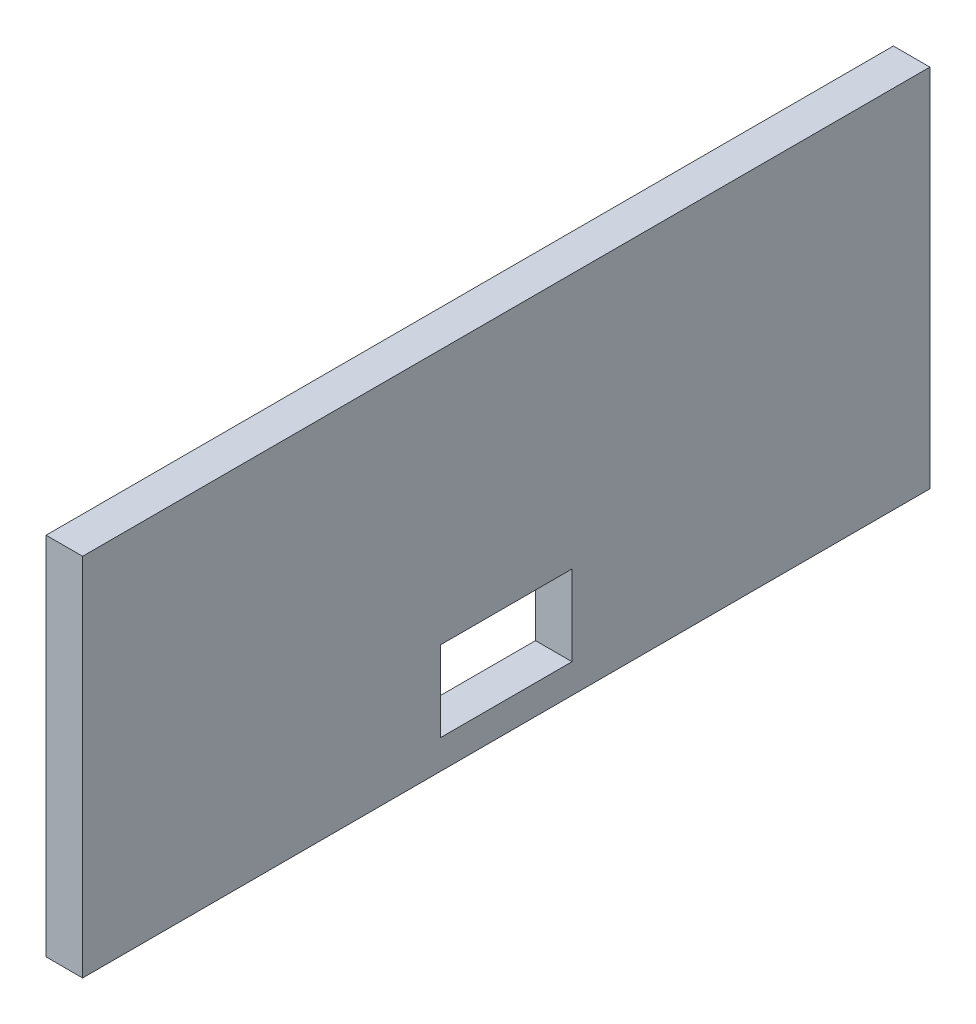
ISO-10303-21;
HEADER;
FILE_DESCRIPTION(('STEP AP214'),'2;1');
FILE_NAME('part.step','',(''),(''),'','','');
FILE_SCHEMA(('AUTOMOTIVE_DESIGN { 1 0 10303 214 1 1 1 1 }'));
ENDSEC;
DATA;
#1=APPLICATION_CONTEXT('core data for automotive mechanical design processes');
#2=APPLICATION_PROTOCOL_DEFINITION('international standard','automotive_design',2000,#1);
#3=PRODUCT_CONTEXT('',#1,'mechanical');
#4=PRODUCT('Part','Part','',(#3));
#5=PRODUCT_RELATED_PRODUCT_CATEGORY('part','',(#4));
#6=PRODUCT_DEFINITION_FORMATION('','',#4);
#7=PRODUCT_DEFINITION_CONTEXT('part definition',#1,'design');
#8=PRODUCT_DEFINITION('design','',#6,#7);
#9=PRODUCT_DEFINITION_SHAPE('','',#8);
#10=(LENGTH_UNIT() NAMED_UNIT(*) SI_UNIT(.MILLI.,.METRE.));
#11=(NAMED_UNIT(*) PLANE_ANGLE_UNIT() SI_UNIT($,.RADIAN.));
#12=(NAMED_UNIT(*) SI_UNIT($,.STERADIAN.) SOLID_ANGLE_UNIT());
#13=UNCERTAINTY_MEASURE_WITH_UNIT(LENGTH_MEASURE(1.E-05),#10,'distance_accuracy_value','');
#14=(GEOMETRIC_REPRESENTATION_CONTEXT(3) GLOBAL_UNCERTAINTY_ASSIGNED_CONTEXT((#13)) GLOBAL_UNIT_ASSIGNED_CONTEXT((#10,
#11,#12)) REPRESENTATION_CONTEXT('',''));
#15=CARTESIAN_POINT('',(0.,0.,0.));
#16=DIRECTION('',(0.,0.,1.));
#17=DIRECTION('',(1.,0.,0.));
#18=AXIS2_PLACEMENT_3D('',#15,#16,#17);
#19=CARTESIAN_POINT('',(-48.4632,-31.75,36.83));
#20=DIRECTION('',(1.,0.,0.));
#21=DIRECTION('',(0.,0.,-1.));
#22=AXIS2_PLACEMENT_3D('',#19,#20,#21);
#23=PLANE('',#22);
#24=DIRECTION('',(0.,0.,1.));
#25=VECTOR('',#24,1.);
#26=CARTESIAN_POINT('',(-48.4632,-29.21,-5.71500000000001));
#27=LINE('',#26,#25);
#28=CARTESIAN_POINT('',(-48.4632,-29.21,-5.71500000000001));
#29=VERTEX_POINT('',#28);
#30=CARTESIAN_POINT('',(-48.4632,-29.21,5.71500000000001));
#31=VERTEX_POINT('',#30);
#32=EDGE_CURVE('E118',#29,#31,#27,.T.);
#33=ORIENTED_EDGE('',*,*,#32,.F.);
#34=DIRECTION('',(0.,-1.,0.));
#35=VECTOR('',#34,1.);
#36=CARTESIAN_POINT('',(-48.4632,-22.225,-5.71500000000001));
#37=LINE('',#36,#35);
#38=CARTESIAN_POINT('',(-48.4632,-22.225,-5.71500000000001));
#39=VERTEX_POINT('',#38);
#40=EDGE_CURVE('E46',#39,#29,#37,.T.);
#41=ORIENTED_EDGE('',*,*,#40,.F.);
#42=DIRECTION('',(0.,0.,-1.));
#43=VECTOR('',#42,1.);
#44=CARTESIAN_POINT('',(-48.4632,-22.225,-5.71500000000001));
#45=LINE('',#44,#43);
#46=CARTESIAN_POINT('',(-48.4632,-22.225,5.71499999999999));
#47=VERTEX_POINT('',#46);
#48=EDGE_CURVE('E104',#47,#39,#45,.T.);
#49=ORIENTED_EDGE('',*,*,#48,.F.);
#50=DIRECTION('',(0.,1.,0.));
#51=VECTOR('',#50,1.);
#52=CARTESIAN_POINT('',(-48.4632,-22.225,5.71499999999999));
#53=LINE('',#52,#51);
#54=EDGE_CURVE('E124',#31,#47,#53,.T.);
#55=ORIENTED_EDGE('',*,*,#54,.F.);
#56=EDGE_LOOP('',(#33,#41,#49,#55));
#57=FACE_BOUND('',#56,.T.);
#58=DIRECTION('',(0.,0.,-1.));
#59=VECTOR('',#58,1.);
#60=CARTESIAN_POINT('',(-48.4632,0.,36.83));
#61=LINE('',#60,#59);
#62=CARTESIAN_POINT('',(-48.4632,0.,36.83));
#63=VERTEX_POINT('',#62);
#64=CARTESIAN_POINT('',(-48.4632,0.,-36.83));
#65=VERTEX_POINT('',#64);
#66=EDGE_CURVE('E110',#63,#65,#61,.T.);
#67=ORIENTED_EDGE('',*,*,#66,.T.);
#68=DIRECTION('',(0.,1.,0.));
#69=VECTOR('',#68,1.);
#70=CARTESIAN_POINT('',(-48.4632,-31.75,-36.83));
#71=LINE('',#70,#69);
#72=CARTESIAN_POINT('',(-48.4632,-31.75,-36.83));
#73=VERTEX_POINT('',#72);
#74=EDGE_CURVE('E11',#73,#65,#71,.T.);
#75=ORIENTED_EDGE('',*,*,#74,.F.);
#76=DIRECTION('',(0.,0.,-1.));
#77=VECTOR('',#76,1.);
#78=CARTESIAN_POINT('',(-48.4632,-31.75,36.83));
#79=LINE('',#78,#77);
#80=CARTESIAN_POINT('',(-48.4632,-31.75,36.83));
#81=VERTEX_POINT('',#80);
#82=EDGE_CURVE('E133',#81,#73,#79,.T.);
#83=ORIENTED_EDGE('',*,*,#82,.F.);
#84=DIRECTION('',(0.,1.,0.));
#85=VECTOR('',#84,1.);
#86=CARTESIAN_POINT('',(-48.4632,-31.75,36.83));
#87=LINE('',#86,#85);
#88=EDGE_CURVE('E143',#81,#63,#87,.T.);
#89=ORIENTED_EDGE('',*,*,#88,.T.);
#90=EDGE_LOOP('',(#67,#75,#83,#89));
#91=FACE_BOUND('',#90,.T.);
#92=ADVANCED_FACE('F32',(#57,#91),#23,.F.);
#93=CARTESIAN_POINT('',(-48.4632,-31.75,-36.83));
#94=DIRECTION('',(0.,0.,1.));
#95=DIRECTION('',(1.,0.,0.));
#96=AXIS2_PLACEMENT_3D('',#93,#94,#95);
#97=PLANE('',#96);
#98=DIRECTION('',(1.,0.,0.));
#99=VECTOR('',#98,1.);
#100=CARTESIAN_POINT('',(-48.4632,0.,-36.83));
#101=LINE('',#100,#99);
#102=CARTESIAN_POINT('',(-45.2882,0.,-36.83));
#103=VERTEX_POINT('',#102);
#104=EDGE_CURVE('E146',#65,#103,#101,.T.);
#105=ORIENTED_EDGE('',*,*,#104,.T.);
#106=DIRECTION('',(0.,1.,0.));
#107=VECTOR('',#106,1.);
#108=CARTESIAN_POINT('',(-45.2882,-31.75,-36.83));
#109=LINE('',#108,#107);
#110=CARTESIAN_POINT('',(-45.2882,-31.75,-36.83));
#111=VERTEX_POINT('',#110);
#112=EDGE_CURVE('E39',#111,#103,#109,.T.);
#113=ORIENTED_EDGE('',*,*,#112,.F.);
#114=DIRECTION('',(1.,0.,0.));
#115=VECTOR('',#114,1.);
#116=CARTESIAN_POINT('',(-48.4632,-31.75,-36.83));
#117=LINE('',#116,#115);
#118=EDGE_CURVE('E136',#73,#111,#117,.T.);
#119=ORIENTED_EDGE('',*,*,#118,.F.);
#120=ORIENTED_EDGE('',*,*,#74,.T.);
#121=EDGE_LOOP('',(#105,#113,#119,#120));
#122=FACE_BOUND('',#121,.T.);
#123=ADVANCED_FACE('F174',(#122),#97,.F.);
#124=CARTESIAN_POINT('',(-45.2882,-31.75,36.83));
#125=DIRECTION('',(-1.,0.,0.));
#126=DIRECTION('',(0.,0.,1.));
#127=AXIS2_PLACEMENT_3D('',#124,#125,#126);
#128=PLANE('',#127);
#129=DIRECTION('',(0.,0.,1.));
#130=VECTOR('',#129,1.);
#131=CARTESIAN_POINT('',(-45.2882,-22.225,-5.71500000000003));
#132=LINE('',#131,#130);
#133=CARTESIAN_POINT('',(-45.2882,-22.225,-5.71500000000001));
#134=VERTEX_POINT('',#133);
#135=CARTESIAN_POINT('',(-45.2882,-22.225,5.71499999999999));
#136=VERTEX_POINT('',#135);
#137=EDGE_CURVE('E116',#134,#136,#132,.T.);
#138=ORIENTED_EDGE('',*,*,#137,.F.);
#139=DIRECTION('',(0.,1.,0.));
#140=VECTOR('',#139,1.);
#141=CARTESIAN_POINT('',(-45.2882,-22.225,-5.71500000000001));
#142=LINE('',#141,#140);
#143=CARTESIAN_POINT('',(-45.2882,-29.21,-5.71500000000001));
#144=VERTEX_POINT('',#143);
#145=EDGE_CURVE('E98',#144,#134,#142,.T.);
#146=ORIENTED_EDGE('',*,*,#145,.F.);
#147=DIRECTION('',(0.,0.,-1.));
#148=VECTOR('',#147,1.);
#149=CARTESIAN_POINT('',(-45.2882,-29.21,-5.71500000000003));
#150=LINE('',#149,#148);
#151=CARTESIAN_POINT('',(-45.2882,-29.21,5.71500000000001));
#152=VERTEX_POINT('',#151);
#153=EDGE_CURVE('E107',#152,#144,#150,.T.);
#154=ORIENTED_EDGE('',*,*,#153,.F.);
#155=DIRECTION('',(0.,-1.,0.));
#156=VECTOR('',#155,1.);
#157=CARTESIAN_POINT('',(-45.2882,-22.225,5.71499999999999));
#158=LINE('',#157,#156);
#159=EDGE_CURVE('E54',#136,#152,#158,.T.);
#160=ORIENTED_EDGE('',*,*,#159,.F.);
#161=EDGE_LOOP('',(#138,#146,#154,#160));
#162=FACE_BOUND('',#161,.T.);
#163=DIRECTION('',(0.,0.,1.));
#164=VECTOR('',#163,1.);
#165=CARTESIAN_POINT('',(-45.2882,0.,36.83));
#166=LINE('',#165,#164);
#167=CARTESIAN_POINT('',(-45.2882,0.,36.83));
#168=VERTEX_POINT('',#167);
#169=EDGE_CURVE('E148',#103,#168,#166,.T.);
#170=ORIENTED_EDGE('',*,*,#169,.T.);
#171=DIRECTION('',(0.,1.,0.));
#172=VECTOR('',#171,1.);
#173=CARTESIAN_POINT('',(-45.2882,-31.75,36.83));
#174=LINE('',#173,#172);
#175=CARTESIAN_POINT('',(-45.2882,-31.75,36.83));
#176=VERTEX_POINT('',#175);
#177=EDGE_CURVE('E153',#176,#168,#174,.T.);
#178=ORIENTED_EDGE('',*,*,#177,.F.);
#179=DIRECTION('',(0.,0.,1.));
#180=VECTOR('',#179,1.);
#181=CARTESIAN_POINT('',(-45.2882,-31.75,36.83));
#182=LINE('',#181,#180);
#183=EDGE_CURVE('E139',#111,#176,#182,.T.);
#184=ORIENTED_EDGE('',*,*,#183,.F.);
#185=ORIENTED_EDGE('',*,*,#112,.T.);
#186=EDGE_LOOP('',(#170,#178,#184,#185));
#187=FACE_BOUND('',#186,.T.);
#188=ADVANCED_FACE('F113',(#162,#187),#128,.F.);
#189=CARTESIAN_POINT('',(-48.4632,-31.75,36.83));
#190=DIRECTION('',(0.,0.,-1.));
#191=DIRECTION('',(-1.,0.,0.));
#192=AXIS2_PLACEMENT_3D('',#189,#190,#191);
#193=PLANE('',#192);
#194=DIRECTION('',(-1.,0.,0.));
#195=VECTOR('',#194,1.);
#196=CARTESIAN_POINT('',(-48.4632,0.,36.83));
#197=LINE('',#196,#195);
#198=EDGE_CURVE('E137',#168,#63,#197,.T.);
#199=ORIENTED_EDGE('',*,*,#198,.T.);
#200=ORIENTED_EDGE('',*,*,#88,.F.);
#201=DIRECTION('',(-1.,0.,0.));
#202=VECTOR('',#201,1.);
#203=CARTESIAN_POINT('',(-48.4632,-31.75,36.83));
#204=LINE('',#203,#202);
#205=EDGE_CURVE('E141',#176,#81,#204,.T.);
#206=ORIENTED_EDGE('',*,*,#205,.F.);
#207=ORIENTED_EDGE('',*,*,#177,.T.);
#208=EDGE_LOOP('',(#199,#200,#206,#207));
#209=FACE_BOUND('',#208,.T.);
#210=ADVANCED_FACE('F167',(#209),#193,.F.);
#211=CARTESIAN_POINT('',(0.,-31.75,0.));
#212=DIRECTION('',(0.,-1.,0.));
#213=DIRECTION('',(0.,0.,-1.));
#214=AXIS2_PLACEMENT_3D('',#211,#212,#213);
#215=PLANE('',#214);
#216=ORIENTED_EDGE('',*,*,#82,.T.);
#217=ORIENTED_EDGE('',*,*,#118,.T.);
#218=ORIENTED_EDGE('',*,*,#183,.T.);
#219=ORIENTED_EDGE('',*,*,#205,.T.);
#220=EDGE_LOOP('',(#216,#217,#218,#219));
#221=FACE_BOUND('',#220,.T.);
#222=ADVANCED_FACE('F173',(#221),#215,.T.);
#223=CARTESIAN_POINT('',(0.,0.,0.));
#224=DIRECTION('',(0.,-1.,0.));
#225=DIRECTION('',(0.,0.,-1.));
#226=AXIS2_PLACEMENT_3D('',#223,#224,#225);
#227=PLANE('',#226);
#228=ORIENTED_EDGE('',*,*,#66,.F.);
#229=ORIENTED_EDGE('',*,*,#198,.F.);
#230=ORIENTED_EDGE('',*,*,#169,.F.);
#231=ORIENTED_EDGE('',*,*,#104,.F.);
#232=EDGE_LOOP('',(#228,#229,#230,#231));
#233=FACE_BOUND('',#232,.T.);
#234=ADVANCED_FACE('F164',(#233),#227,.F.);
#235=CARTESIAN_POINT('',(49.7342000000001,-22.225,-5.71500000000001));
#236=DIRECTION('',(0.,0.,-1.));
#237=DIRECTION('',(0.,1.,0.));
#238=AXIS2_PLACEMENT_3D('',#235,#236,#237);
#239=PLANE('',#238);
#240=ORIENTED_EDGE('',*,*,#145,.T.);
#241=DIRECTION('',(-1.,0.,0.));
#242=VECTOR('',#241,1.);
#243=CARTESIAN_POINT('',(49.7342000000001,-22.225,-5.71500000000001));
#244=LINE('',#243,#242);
#245=EDGE_CURVE('E111',#134,#39,#244,.T.);
#246=ORIENTED_EDGE('',*,*,#245,.T.);
#247=ORIENTED_EDGE('',*,*,#40,.T.);
#248=DIRECTION('',(-1.,0.,0.));
#249=VECTOR('',#248,1.);
#250=CARTESIAN_POINT('',(49.7342000000001,-29.21,-5.71500000000001));
#251=LINE('',#250,#249);
#252=EDGE_CURVE('E94',#144,#29,#251,.T.);
#253=ORIENTED_EDGE('',*,*,#252,.F.);
#254=EDGE_LOOP('',(#240,#246,#247,#253));
#255=FACE_BOUND('',#254,.T.);
#256=ADVANCED_FACE('F96',(#255),#239,.F.);
#257=CARTESIAN_POINT('',(49.7342000000001,-22.225,-5.71500000000001));
#258=DIRECTION('',(0.,1.,0.));
#259=DIRECTION('',(0.,0.,1.));
#260=AXIS2_PLACEMENT_3D('',#257,#258,#259);
#261=PLANE('',#260);
#262=ORIENTED_EDGE('',*,*,#137,.T.);
#263=DIRECTION('',(-1.,0.,0.));
#264=VECTOR('',#263,1.);
#265=CARTESIAN_POINT('',(49.7342000000001,-22.225,5.71499999999999));
#266=LINE('',#265,#264);
#267=EDGE_CURVE('E130',#136,#47,#266,.T.);
#268=ORIENTED_EDGE('',*,*,#267,.T.);
#269=ORIENTED_EDGE('',*,*,#48,.T.);
#270=ORIENTED_EDGE('',*,*,#245,.F.);
#271=EDGE_LOOP('',(#262,#268,#269,#270));
#272=FACE_BOUND('',#271,.T.);
#273=ADVANCED_FACE('F191',(#272),#261,.F.);
#274=CARTESIAN_POINT('',(49.7342000000001,-22.225,5.71499999999999));
#275=DIRECTION('',(0.,0.,1.));
#276=DIRECTION('',(0.,-1.,0.));
#277=AXIS2_PLACEMENT_3D('',#274,#275,#276);
#278=PLANE('',#277);
#279=ORIENTED_EDGE('',*,*,#159,.T.);
#280=DIRECTION('',(-1.,0.,0.));
#281=VECTOR('',#280,1.);
#282=CARTESIAN_POINT('',(49.7342000000001,-29.21,5.71500000000001));
#283=LINE('',#282,#281);
#284=EDGE_CURVE('E103',#152,#31,#283,.T.);
#285=ORIENTED_EDGE('',*,*,#284,.T.);
#286=ORIENTED_EDGE('',*,*,#54,.T.);
#287=ORIENTED_EDGE('',*,*,#267,.F.);
#288=EDGE_LOOP('',(#279,#285,#286,#287));
#289=FACE_BOUND('',#288,.T.);
#290=ADVANCED_FACE('F194',(#289),#278,.F.);
#291=CARTESIAN_POINT('',(49.7342000000001,-29.21,-5.71500000000001));
#292=DIRECTION('',(0.,-1.,0.));
#293=DIRECTION('',(0.,0.,-1.));
#294=AXIS2_PLACEMENT_3D('',#291,#292,#293);
#295=PLANE('',#294);
#296=ORIENTED_EDGE('',*,*,#153,.T.);
#297=ORIENTED_EDGE('',*,*,#252,.T.);
#298=ORIENTED_EDGE('',*,*,#32,.T.);
#299=ORIENTED_EDGE('',*,*,#284,.F.);
#300=EDGE_LOOP('',(#296,#297,#298,#299));
#301=FACE_BOUND('',#300,.T.);
#302=ADVANCED_FACE('F108',(#301),#295,.F.);
#303=CLOSED_SHELL('',(#92,#123,#188,#210,#222,#234,#256,#273,#290,#302));
#304=MANIFOLD_SOLID_BREP('B2',#303);
#305=ADVANCED_BREP_SHAPE_REPRESENTATION('',(#18,#304),#14);
#306=SHAPE_DEFINITION_REPRESENTATION(#9,#305);
ENDSEC;
END-ISO-10303-21;
